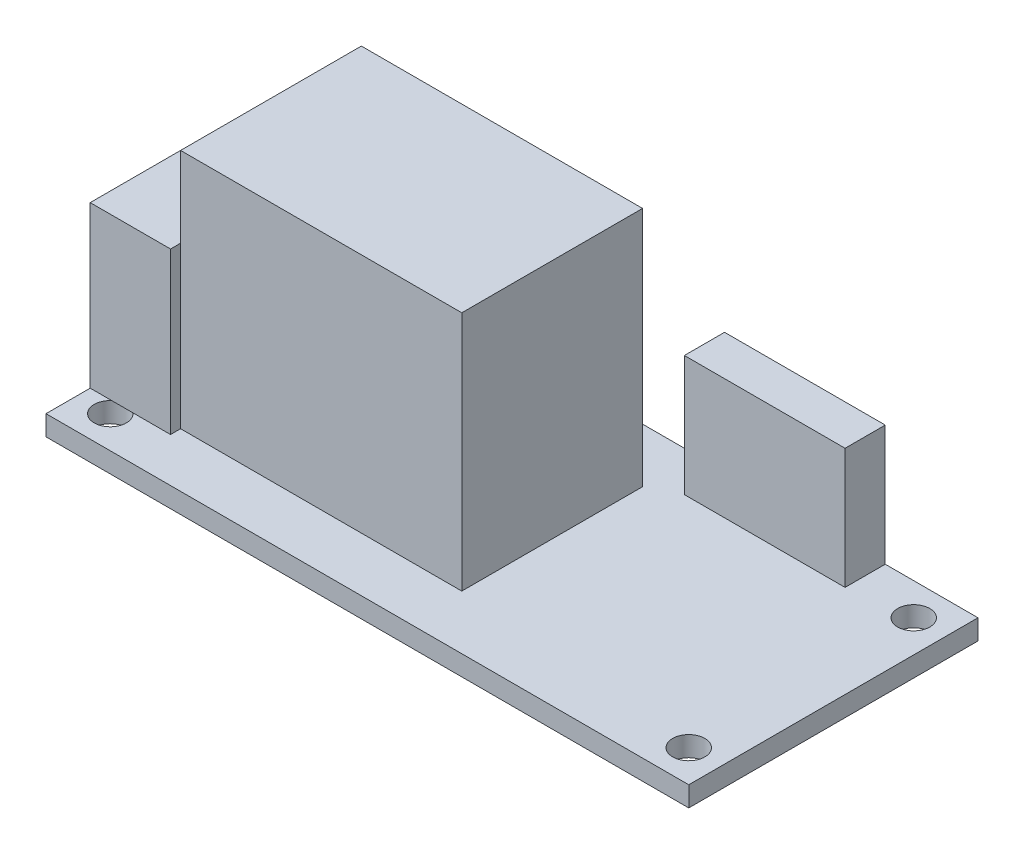
ISO-10303-21;
HEADER;
FILE_DESCRIPTION(('STEP AP214'),'2;1');
FILE_NAME('part.step','',(''),(''),'','','');
FILE_SCHEMA(('AUTOMOTIVE_DESIGN { 1 0 10303 214 1 1 1 1 }'));
ENDSEC;
DATA;
#1=APPLICATION_CONTEXT('core data for automotive mechanical design processes');
#2=APPLICATION_PROTOCOL_DEFINITION('international standard','automotive_design',2000,#1);
#3=PRODUCT_CONTEXT('',#1,'mechanical');
#4=PRODUCT('Part','Part','',(#3));
#5=PRODUCT_RELATED_PRODUCT_CATEGORY('part','',(#4));
#6=PRODUCT_DEFINITION_FORMATION('','',#4);
#7=PRODUCT_DEFINITION_CONTEXT('part definition',#1,'design');
#8=PRODUCT_DEFINITION('design','',#6,#7);
#9=PRODUCT_DEFINITION_SHAPE('','',#8);
#10=(LENGTH_UNIT() NAMED_UNIT(*) SI_UNIT(.MILLI.,.METRE.));
#11=(NAMED_UNIT(*) PLANE_ANGLE_UNIT() SI_UNIT($,.RADIAN.));
#12=(NAMED_UNIT(*) SI_UNIT($,.STERADIAN.) SOLID_ANGLE_UNIT());
#13=UNCERTAINTY_MEASURE_WITH_UNIT(LENGTH_MEASURE(1.E-05),#10,'distance_accuracy_value','');
#14=(GEOMETRIC_REPRESENTATION_CONTEXT(3) GLOBAL_UNCERTAINTY_ASSIGNED_CONTEXT((#13)) GLOBAL_UNIT_ASSIGNED_CONTEXT((#10,
#11,#12)) REPRESENTATION_CONTEXT('',''));
#15=CARTESIAN_POINT('',(0.,0.,0.));
#16=DIRECTION('',(0.,0.,1.));
#17=DIRECTION('',(1.,0.,0.));
#18=AXIS2_PLACEMENT_3D('',#15,#16,#17);
#19=CARTESIAN_POINT('',(0.,1.5875,0.));
#20=DIRECTION('',(0.,1.,0.));
#21=DIRECTION('',(0.,0.,1.));
#22=AXIS2_PLACEMENT_3D('',#19,#20,#21);
#23=PLANE('',#22);
#24=CARTESIAN_POINT('',(22.86,1.5875,-8.89));
#25=DIRECTION('',(0.,1.,0.));
#26=DIRECTION('',(0.,0.,1.));
#27=AXIS2_PLACEMENT_3D('',#24,#25,#26);
#28=CIRCLE('',#27,1.27);
#29=CARTESIAN_POINT('',(22.86,1.5875,-7.62));
#30=VERTEX_POINT('',#29);
#31=EDGE_CURVE('E325',#30,#30,#28,.T.);
#32=ORIENTED_EDGE('',*,*,#31,.F.);
#33=EDGE_LOOP('',(#32));
#34=FACE_BOUND('',#33,.T.);
#35=CARTESIAN_POINT('',(-22.86,1.5875,8.89));
#36=DIRECTION('',(0.,1.,0.));
#37=DIRECTION('',(0.,0.,1.));
#38=AXIS2_PLACEMENT_3D('',#35,#36,#37);
#39=CIRCLE('',#38,1.27);
#40=CARTESIAN_POINT('',(-23.700026041263,1.5875,7.9375));
#41=VERTEX_POINT('',#40);
#42=CARTESIAN_POINT('',(-22.019973958737,1.5875,7.9375));
#43=VERTEX_POINT('',#42);
#44=EDGE_CURVE('E321',#41,#43,#39,.T.);
#45=ORIENTED_EDGE('',*,*,#44,.F.);
#46=DIRECTION('',(1.,0.,0.));
#47=VECTOR('',#46,1.);
#48=CARTESIAN_POINT('',(-25.4,1.5875,7.9375));
#49=LINE('',#48,#47);
#50=CARTESIAN_POINT('',(-25.4,1.5875,7.9375));
#51=VERTEX_POINT('',#50);
#52=EDGE_CURVE('E216',#51,#41,#49,.T.);
#53=ORIENTED_EDGE('',*,*,#52,.F.);
#54=DIRECTION('',(0.,0.,1.));
#55=VECTOR('',#54,1.);
#56=CARTESIAN_POINT('',(-25.4,1.5875,-11.43));
#57=LINE('',#56,#55);
#58=CARTESIAN_POINT('',(-25.4,1.5875,11.43));
#59=VERTEX_POINT('',#58);
#60=EDGE_CURVE('E462',#51,#59,#57,.T.);
#61=ORIENTED_EDGE('',*,*,#60,.T.);
#62=DIRECTION('',(1.,0.,0.));
#63=VECTOR('',#62,1.);
#64=CARTESIAN_POINT('',(-25.4,1.5875,11.43));
#65=LINE('',#64,#63);
#66=CARTESIAN_POINT('',(25.4,1.5875,11.43));
#67=VERTEX_POINT('',#66);
#68=EDGE_CURVE('E458',#59,#67,#65,.T.);
#69=ORIENTED_EDGE('',*,*,#68,.T.);
#70=DIRECTION('',(0.,0.,-1.));
#71=VECTOR('',#70,1.);
#72=CARTESIAN_POINT('',(25.4,1.5875,-11.43));
#73=LINE('',#72,#71);
#74=CARTESIAN_POINT('',(25.4,1.5875,-11.43));
#75=VERTEX_POINT('',#74);
#76=EDGE_CURVE('E450',#67,#75,#73,.T.);
#77=ORIENTED_EDGE('',*,*,#76,.T.);
#78=DIRECTION('',(-1.,0.,0.));
#79=VECTOR('',#78,1.);
#80=CARTESIAN_POINT('',(-25.4,1.5875,-11.43));
#81=LINE('',#80,#79);
#82=CARTESIAN_POINT('',(18.0694027794747,1.5875,-11.43));
#83=VERTEX_POINT('',#82);
#84=EDGE_CURVE('E464',#75,#83,#81,.T.);
#85=ORIENTED_EDGE('',*,*,#84,.T.);
#86=DIRECTION('',(0.,0.,-1.));
#87=VECTOR('',#86,1.);
#88=CARTESIAN_POINT('',(18.0694027794747,1.5875,-11.43));
#89=LINE('',#88,#87);
#90=CARTESIAN_POINT('',(18.0694027794747,1.5875,-8.255));
#91=VERTEX_POINT('',#90);
#92=EDGE_CURVE('E291',#91,#83,#89,.T.);
#93=ORIENTED_EDGE('',*,*,#92,.F.);
#94=DIRECTION('',(1.,0.,0.));
#95=VECTOR('',#94,1.);
#96=CARTESIAN_POINT('',(5.36940277947472,1.5875,-8.255));
#97=LINE('',#96,#95);
#98=CARTESIAN_POINT('',(5.36940277947472,1.5875,-8.255));
#99=VERTEX_POINT('',#98);
#100=EDGE_CURVE('E296',#99,#91,#97,.T.);
#101=ORIENTED_EDGE('',*,*,#100,.F.);
#102=DIRECTION('',(0.,0.,1.));
#103=VECTOR('',#102,1.);
#104=CARTESIAN_POINT('',(5.36940277947472,1.5875,-11.43));
#105=LINE('',#104,#103);
#106=CARTESIAN_POINT('',(5.36940277947472,1.5875,-11.43));
#107=VERTEX_POINT('',#106);
#108=EDGE_CURVE('E300',#107,#99,#105,.T.);
#109=ORIENTED_EDGE('',*,*,#108,.F.);
#110=CARTESIAN_POINT('',(-25.4,1.5875,-11.43));
#111=VERTEX_POINT('',#110);
#112=EDGE_CURVE('E473',#107,#111,#81,.T.);
#113=ORIENTED_EDGE('',*,*,#112,.T.);
#114=CARTESIAN_POINT('',(-25.4,1.5875,-7.9375));
#115=VERTEX_POINT('',#114);
#116=EDGE_CURVE('E442',#111,#115,#57,.T.);
#117=ORIENTED_EDGE('',*,*,#116,.T.);
#118=DIRECTION('',(-1.,0.,0.));
#119=VECTOR('',#118,1.);
#120=CARTESIAN_POINT('',(-25.4,1.5875,-7.9375));
#121=LINE('',#120,#119);
#122=CARTESIAN_POINT('',(-23.700026041263,1.5875,-7.9375));
#123=VERTEX_POINT('',#122);
#124=EDGE_CURVE('E178',#123,#115,#121,.T.);
#125=ORIENTED_EDGE('',*,*,#124,.F.);
#126=CARTESIAN_POINT('',(-22.86,1.5875,-8.89));
#127=DIRECTION('',(0.,1.,0.));
#128=DIRECTION('',(0.,0.,1.));
#129=AXIS2_PLACEMENT_3D('',#126,#127,#128);
#130=CIRCLE('',#129,1.27);
#131=CARTESIAN_POINT('',(-22.019973958737,1.5875,-7.9375));
#132=VERTEX_POINT('',#131);
#133=EDGE_CURVE('E60',#132,#123,#130,.T.);
#134=ORIENTED_EDGE('',*,*,#133,.F.);
#135=CARTESIAN_POINT('',(-19.05,1.5875,-7.9375));
#136=VERTEX_POINT('',#135);
#137=EDGE_CURVE('E177',#136,#132,#121,.T.);
#138=ORIENTED_EDGE('',*,*,#137,.F.);
#139=DIRECTION('',(0.,0.,-1.));
#140=VECTOR('',#139,1.);
#141=CARTESIAN_POINT('',(-19.05,1.5875,7.9375));
#142=LINE('',#141,#140);
#143=CARTESIAN_POINT('',(-19.05,1.5875,-7.14375));
#144=VERTEX_POINT('',#143);
#145=EDGE_CURVE('E210',#144,#136,#142,.T.);
#146=ORIENTED_EDGE('',*,*,#145,.F.);
#147=DIRECTION('',(-1.,0.,0.));
#148=VECTOR('',#147,1.);
#149=CARTESIAN_POINT('',(-19.05,1.5875,-7.14375));
#150=LINE('',#149,#148);
#151=CARTESIAN_POINT('',(3.175,1.5875,-7.14375));
#152=VERTEX_POINT('',#151);
#153=EDGE_CURVE('E256',#152,#144,#150,.T.);
#154=ORIENTED_EDGE('',*,*,#153,.F.);
#155=DIRECTION('',(0.,0.,-1.));
#156=VECTOR('',#155,1.);
#157=CARTESIAN_POINT('',(3.175,1.5875,-7.14375));
#158=LINE('',#157,#156);
#159=CARTESIAN_POINT('',(3.17500000000001,1.5875,7.14375));
#160=VERTEX_POINT('',#159);
#161=EDGE_CURVE('E259',#160,#152,#158,.T.);
#162=ORIENTED_EDGE('',*,*,#161,.F.);
#163=DIRECTION('',(1.,0.,0.));
#164=VECTOR('',#163,1.);
#165=CARTESIAN_POINT('',(-19.05,1.5875,7.14375));
#166=LINE('',#165,#164);
#167=CARTESIAN_POINT('',(-19.05,1.5875,7.14375));
#168=VERTEX_POINT('',#167);
#169=EDGE_CURVE('E252',#168,#160,#166,.T.);
#170=ORIENTED_EDGE('',*,*,#169,.F.);
#171=CARTESIAN_POINT('',(-19.05,1.5875,7.9375));
#172=VERTEX_POINT('',#171);
#173=EDGE_CURVE('E206',#172,#168,#142,.T.);
#174=ORIENTED_EDGE('',*,*,#173,.F.);
#175=EDGE_CURVE('E222',#43,#172,#49,.T.);
#176=ORIENTED_EDGE('',*,*,#175,.F.);
#177=EDGE_LOOP('',(#45,#53,#61,#69,#77,#85,#93,#101,#109,#113,#117,#125,#134,#138,#146,#154,
#162,#170,#174,#176));
#178=FACE_BOUND('',#177,.T.);
#179=CARTESIAN_POINT('',(22.86,1.5875,8.89));
#180=DIRECTION('',(0.,1.,0.));
#181=DIRECTION('',(0.,0.,1.));
#182=AXIS2_PLACEMENT_3D('',#179,#180,#181);
#183=CIRCLE('',#182,1.27);
#184=CARTESIAN_POINT('',(22.86,1.5875,10.16));
#185=VERTEX_POINT('',#184);
#186=EDGE_CURVE('E332',#185,#185,#183,.T.);
#187=ORIENTED_EDGE('',*,*,#186,.F.);
#188=EDGE_LOOP('',(#187));
#189=FACE_BOUND('',#188,.T.);
#190=ADVANCED_FACE('F38',(#34,#178,#189),#23,.T.);
#191=CARTESIAN_POINT('',(-19.05,14.2875,7.9375));
#192=DIRECTION('',(-1.,0.,0.));
#193=DIRECTION('',(0.,0.,1.));
#194=AXIS2_PLACEMENT_3D('',#191,#192,#193);
#195=PLANE('',#194);
#196=DIRECTION('',(0.,-1.,0.));
#197=VECTOR('',#196,1.);
#198=CARTESIAN_POINT('',(-19.05,20.6375,-7.14375));
#199=LINE('',#198,#197);
#200=CARTESIAN_POINT('',(-19.05,14.2875,-7.14375));
#201=VERTEX_POINT('',#200);
#202=EDGE_CURVE('E241',#201,#144,#199,.T.);
#203=ORIENTED_EDGE('',*,*,#202,.T.);
#204=ORIENTED_EDGE('',*,*,#145,.T.);
#205=DIRECTION('',(0.,-1.,0.));
#206=VECTOR('',#205,1.);
#207=CARTESIAN_POINT('',(-19.05,14.2875,-7.9375));
#208=LINE('',#207,#206);
#209=CARTESIAN_POINT('',(-19.05,14.2875,-7.9375));
#210=VERTEX_POINT('',#209);
#211=EDGE_CURVE('E196',#210,#136,#208,.T.);
#212=ORIENTED_EDGE('',*,*,#211,.F.);
#213=DIRECTION('',(0.,0.,-1.));
#214=VECTOR('',#213,1.);
#215=CARTESIAN_POINT('',(-19.05,14.2875,7.9375));
#216=LINE('',#215,#214);
#217=EDGE_CURVE('E232',#201,#210,#216,.T.);
#218=ORIENTED_EDGE('',*,*,#217,.F.);
#219=EDGE_LOOP('',(#203,#204,#212,#218));
#220=FACE_BOUND('',#219,.T.);
#221=ADVANCED_FACE('F382',(#220),#195,.F.);
#222=DIRECTION('',(0.,-1.,0.));
#223=VECTOR('',#222,1.);
#224=CARTESIAN_POINT('',(-19.05,20.6375,7.14375));
#225=LINE('',#224,#223);
#226=CARTESIAN_POINT('',(-19.05,14.2875,7.14375));
#227=VERTEX_POINT('',#226);
#228=EDGE_CURVE('E246',#227,#168,#225,.T.);
#229=ORIENTED_EDGE('',*,*,#228,.F.);
#230=CARTESIAN_POINT('',(-19.05,14.2875,7.9375));
#231=VERTEX_POINT('',#230);
#232=EDGE_CURVE('E227',#231,#227,#216,.T.);
#233=ORIENTED_EDGE('',*,*,#232,.F.);
#234=DIRECTION('',(0.,-1.,0.));
#235=VECTOR('',#234,1.);
#236=CARTESIAN_POINT('',(-19.05,14.2875,7.9375));
#237=LINE('',#236,#235);
#238=EDGE_CURVE('E384',#231,#172,#237,.T.);
#239=ORIENTED_EDGE('',*,*,#238,.T.);
#240=ORIENTED_EDGE('',*,*,#173,.T.);
#241=EDGE_LOOP('',(#229,#233,#239,#240));
#242=FACE_BOUND('',#241,.T.);
#243=ADVANCED_FACE('F397',(#242),#195,.F.);
#244=CARTESIAN_POINT('',(25.4,1.5875,-11.43));
#245=DIRECTION('',(-1.,0.,0.));
#246=DIRECTION('',(0.,0.,1.));
#247=AXIS2_PLACEMENT_3D('',#244,#245,#246);
#248=PLANE('',#247);
#249=DIRECTION('',(0.,0.,-1.));
#250=VECTOR('',#249,1.);
#251=CARTESIAN_POINT('',(25.4,0.,-11.43));
#252=LINE('',#251,#250);
#253=CARTESIAN_POINT('',(25.4,0.,11.43));
#254=VERTEX_POINT('',#253);
#255=CARTESIAN_POINT('',(25.4,0.,-11.43));
#256=VERTEX_POINT('',#255);
#257=EDGE_CURVE('E438',#254,#256,#252,.T.);
#258=ORIENTED_EDGE('',*,*,#257,.T.);
#259=DIRECTION('',(0.,-1.,0.));
#260=VECTOR('',#259,1.);
#261=CARTESIAN_POINT('',(25.4,1.5875,-11.43));
#262=LINE('',#261,#260);
#263=EDGE_CURVE('E11',#75,#256,#262,.T.);
#264=ORIENTED_EDGE('',*,*,#263,.F.);
#265=ORIENTED_EDGE('',*,*,#76,.F.);
#266=DIRECTION('',(0.,-1.,0.));
#267=VECTOR('',#266,1.);
#268=CARTESIAN_POINT('',(25.4,1.5875,11.43));
#269=LINE('',#268,#267);
#270=EDGE_CURVE('E454',#67,#254,#269,.T.);
#271=ORIENTED_EDGE('',*,*,#270,.T.);
#272=EDGE_LOOP('',(#258,#264,#265,#271));
#273=FACE_BOUND('',#272,.T.);
#274=ADVANCED_FACE('F40',(#273),#248,.F.);
#275=CARTESIAN_POINT('',(-25.4,1.5875,-11.43));
#276=DIRECTION('',(0.,0.,1.));
#277=DIRECTION('',(1.,0.,0.));
#278=AXIS2_PLACEMENT_3D('',#275,#276,#277);
#279=PLANE('',#278);
#280=DIRECTION('',(-1.,0.,0.));
#281=VECTOR('',#280,1.);
#282=CARTESIAN_POINT('',(-25.4,0.,-11.43));
#283=LINE('',#282,#281);
#284=CARTESIAN_POINT('',(-25.4,0.,-11.43));
#285=VERTEX_POINT('',#284);
#286=EDGE_CURVE('E429',#256,#285,#283,.T.);
#287=ORIENTED_EDGE('',*,*,#286,.T.);
#288=DIRECTION('',(0.,-1.,0.));
#289=VECTOR('',#288,1.);
#290=CARTESIAN_POINT('',(-25.4,1.5875,-11.43));
#291=LINE('',#290,#289);
#292=EDGE_CURVE('E47',#111,#285,#291,.T.);
#293=ORIENTED_EDGE('',*,*,#292,.F.);
#294=ORIENTED_EDGE('',*,*,#112,.F.);
#295=DIRECTION('',(0.,-1.,0.));
#296=VECTOR('',#295,1.);
#297=CARTESIAN_POINT('',(5.36940277947472,11.1125,-11.43));
#298=LINE('',#297,#296);
#299=CARTESIAN_POINT('',(5.36940277947472,11.1125,-11.43));
#300=VERTEX_POINT('',#299);
#301=EDGE_CURVE('E286',#300,#107,#298,.T.);
#302=ORIENTED_EDGE('',*,*,#301,.F.);
#303=DIRECTION('',(-1.,0.,0.));
#304=VECTOR('',#303,1.);
#305=CARTESIAN_POINT('',(5.36940277947472,11.1125,-11.43));
#306=LINE('',#305,#304);
#307=CARTESIAN_POINT('',(18.0694027794747,11.1125,-11.43));
#308=VERTEX_POINT('',#307);
#309=EDGE_CURVE('E290',#308,#300,#306,.T.);
#310=ORIENTED_EDGE('',*,*,#309,.F.);
#311=DIRECTION('',(0.,-1.,0.));
#312=VECTOR('',#311,1.);
#313=CARTESIAN_POINT('',(18.0694027794747,11.1125,-11.43));
#314=LINE('',#313,#312);
#315=EDGE_CURVE('E282',#308,#83,#314,.T.);
#316=ORIENTED_EDGE('',*,*,#315,.T.);
#317=ORIENTED_EDGE('',*,*,#84,.F.);
#318=ORIENTED_EDGE('',*,*,#263,.T.);
#319=EDGE_LOOP('',(#287,#293,#294,#302,#310,#316,#317,#318));
#320=FACE_BOUND('',#319,.T.);
#321=ADVANCED_FACE('F404',(#320),#279,.F.);
#322=CARTESIAN_POINT('',(-25.4,1.5875,-11.43));
#323=DIRECTION('',(1.,0.,0.));
#324=DIRECTION('',(0.,0.,-1.));
#325=AXIS2_PLACEMENT_3D('',#322,#323,#324);
#326=PLANE('',#325);
#327=DIRECTION('',(0.,0.,1.));
#328=VECTOR('',#327,1.);
#329=CARTESIAN_POINT('',(-25.4,0.,-11.43));
#330=LINE('',#329,#328);
#331=CARTESIAN_POINT('',(-25.4,0.,11.43));
#332=VERTEX_POINT('',#331);
#333=EDGE_CURVE('E437',#285,#332,#330,.T.);
#334=ORIENTED_EDGE('',*,*,#333,.T.);
#335=DIRECTION('',(0.,-1.,0.));
#336=VECTOR('',#335,1.);
#337=CARTESIAN_POINT('',(-25.4,1.5875,11.43));
#338=LINE('',#337,#336);
#339=EDGE_CURVE('E444',#59,#332,#338,.T.);
#340=ORIENTED_EDGE('',*,*,#339,.F.);
#341=ORIENTED_EDGE('',*,*,#60,.F.);
#342=DIRECTION('',(0.,-1.,0.));
#343=VECTOR('',#342,1.);
#344=CARTESIAN_POINT('',(-25.4,14.2875,7.9375));
#345=LINE('',#344,#343);
#346=CARTESIAN_POINT('',(-25.4,14.2875,7.9375));
#347=VERTEX_POINT('',#346);
#348=EDGE_CURVE('E394',#347,#51,#345,.T.);
#349=ORIENTED_EDGE('',*,*,#348,.F.);
#350=DIRECTION('',(0.,0.,1.));
#351=VECTOR('',#350,1.);
#352=CARTESIAN_POINT('',(-25.4,14.2875,7.9375));
#353=LINE('',#352,#351);
#354=CARTESIAN_POINT('',(-25.4,14.2875,-7.9375));
#355=VERTEX_POINT('',#354);
#356=EDGE_CURVE('E198',#355,#347,#353,.T.);
#357=ORIENTED_EDGE('',*,*,#356,.F.);
#358=DIRECTION('',(0.,-1.,0.));
#359=VECTOR('',#358,1.);
#360=CARTESIAN_POINT('',(-25.4,14.2875,-7.9375));
#361=LINE('',#360,#359);
#362=EDGE_CURVE('E226',#355,#115,#361,.T.);
#363=ORIENTED_EDGE('',*,*,#362,.T.);
#364=ORIENTED_EDGE('',*,*,#116,.F.);
#365=ORIENTED_EDGE('',*,*,#292,.T.);
#366=EDGE_LOOP('',(#334,#340,#341,#349,#357,#363,#364,#365));
#367=FACE_BOUND('',#366,.T.);
#368=ADVANCED_FACE('F392',(#367),#326,.F.);
#369=CARTESIAN_POINT('',(-25.4,1.5875,11.43));
#370=DIRECTION('',(0.,0.,-1.));
#371=DIRECTION('',(-1.,0.,0.));
#372=AXIS2_PLACEMENT_3D('',#369,#370,#371);
#373=PLANE('',#372);
#374=DIRECTION('',(1.,0.,0.));
#375=VECTOR('',#374,1.);
#376=CARTESIAN_POINT('',(-25.4,0.,11.43));
#377=LINE('',#376,#375);
#378=EDGE_CURVE('E446',#332,#254,#377,.T.);
#379=ORIENTED_EDGE('',*,*,#378,.T.);
#380=ORIENTED_EDGE('',*,*,#270,.F.);
#381=ORIENTED_EDGE('',*,*,#68,.F.);
#382=ORIENTED_EDGE('',*,*,#339,.T.);
#383=EDGE_LOOP('',(#379,#380,#381,#382));
#384=FACE_BOUND('',#383,.T.);
#385=ADVANCED_FACE('F418',(#384),#373,.F.);
#386=CARTESIAN_POINT('',(0.,0.,0.));
#387=DIRECTION('',(0.,1.,0.));
#388=DIRECTION('',(0.,0.,1.));
#389=AXIS2_PLACEMENT_3D('',#386,#387,#388);
#390=PLANE('',#389);
#391=CARTESIAN_POINT('',(22.86,0.,-8.89));
#392=DIRECTION('',(0.,1.,0.));
#393=DIRECTION('',(0.,0.,1.));
#394=AXIS2_PLACEMENT_3D('',#391,#392,#393);
#395=CIRCLE('',#394,1.27);
#396=CARTESIAN_POINT('',(22.86,0.,-7.62));
#397=VERTEX_POINT('',#396);
#398=EDGE_CURVE('E182',#397,#397,#395,.T.);
#399=ORIENTED_EDGE('',*,*,#398,.T.);
#400=EDGE_LOOP('',(#399));
#401=FACE_BOUND('',#400,.T.);
#402=CARTESIAN_POINT('',(-22.86,0.,8.89));
#403=DIRECTION('',(0.,1.,0.));
#404=DIRECTION('',(0.,0.,1.));
#405=AXIS2_PLACEMENT_3D('',#402,#403,#404);
#406=CIRCLE('',#405,1.27);
#407=CARTESIAN_POINT('',(-22.86,0.,10.16));
#408=VERTEX_POINT('',#407);
#409=EDGE_CURVE('E320',#408,#408,#406,.T.);
#410=ORIENTED_EDGE('',*,*,#409,.T.);
#411=EDGE_LOOP('',(#410));
#412=FACE_BOUND('',#411,.T.);
#413=CARTESIAN_POINT('',(22.86,0.,8.89));
#414=DIRECTION('',(0.,1.,0.));
#415=DIRECTION('',(0.,0.,1.));
#416=AXIS2_PLACEMENT_3D('',#413,#414,#415);
#417=CIRCLE('',#416,1.27);
#418=CARTESIAN_POINT('',(22.86,0.,10.16));
#419=VERTEX_POINT('',#418);
#420=EDGE_CURVE('E336',#419,#419,#417,.T.);
#421=ORIENTED_EDGE('',*,*,#420,.T.);
#422=EDGE_LOOP('',(#421));
#423=FACE_BOUND('',#422,.T.);
#424=CARTESIAN_POINT('',(-22.86,0.,-8.89));
#425=DIRECTION('',(0.,1.,0.));
#426=DIRECTION('',(0.,0.,1.));
#427=AXIS2_PLACEMENT_3D('',#424,#425,#426);
#428=CIRCLE('',#427,1.27);
#429=CARTESIAN_POINT('',(-22.86,0.,-7.61999999999999));
#430=VERTEX_POINT('',#429);
#431=EDGE_CURVE('E192',#430,#430,#428,.T.);
#432=ORIENTED_EDGE('',*,*,#431,.T.);
#433=EDGE_LOOP('',(#432));
#434=FACE_BOUND('',#433,.T.);
#435=ORIENTED_EDGE('',*,*,#257,.F.);
#436=ORIENTED_EDGE('',*,*,#378,.F.);
#437=ORIENTED_EDGE('',*,*,#333,.F.);
#438=ORIENTED_EDGE('',*,*,#286,.F.);
#439=EDGE_LOOP('',(#435,#436,#437,#438));
#440=FACE_BOUND('',#439,.T.);
#441=ADVANCED_FACE('F415',(#401,#412,#423,#434,#440),#390,.F.);
#442=CARTESIAN_POINT('',(-25.4,14.2875,7.9375));
#443=DIRECTION('',(0.,0.,-1.));
#444=DIRECTION('',(-1.,0.,0.));
#445=AXIS2_PLACEMENT_3D('',#442,#443,#444);
#446=PLANE('',#445);
#447=ORIENTED_EDGE('',*,*,#52,.T.);
#448=EDGE_CURVE('E221',#41,#43,#49,.T.);
#449=ORIENTED_EDGE('',*,*,#448,.T.);
#450=ORIENTED_EDGE('',*,*,#175,.T.);
#451=ORIENTED_EDGE('',*,*,#238,.F.);
#452=DIRECTION('',(1.,0.,0.));
#453=VECTOR('',#452,1.);
#454=CARTESIAN_POINT('',(-25.4,14.2875,7.9375));
#455=LINE('',#454,#453);
#456=EDGE_CURVE('E201',#347,#231,#455,.T.);
#457=ORIENTED_EDGE('',*,*,#456,.F.);
#458=ORIENTED_EDGE('',*,*,#348,.T.);
#459=EDGE_LOOP('',(#447,#449,#450,#451,#457,#458));
#460=FACE_BOUND('',#459,.T.);
#461=ADVANCED_FACE('F350',(#460),#446,.F.);
#462=CARTESIAN_POINT('',(-25.4,14.2875,-7.9375));
#463=DIRECTION('',(0.,0.,1.));
#464=DIRECTION('',(1.,0.,0.));
#465=AXIS2_PLACEMENT_3D('',#462,#463,#464);
#466=PLANE('',#465);
#467=ORIENTED_EDGE('',*,*,#137,.T.);
#468=EDGE_CURVE('E170',#132,#123,#121,.T.);
#469=ORIENTED_EDGE('',*,*,#468,.T.);
#470=ORIENTED_EDGE('',*,*,#124,.T.);
#471=ORIENTED_EDGE('',*,*,#362,.F.);
#472=DIRECTION('',(-1.,0.,0.));
#473=VECTOR('',#472,1.);
#474=CARTESIAN_POINT('',(-25.4,14.2875,-7.9375));
#475=LINE('',#474,#473);
#476=EDGE_CURVE('E223',#210,#355,#475,.T.);
#477=ORIENTED_EDGE('',*,*,#476,.F.);
#478=ORIENTED_EDGE('',*,*,#211,.T.);
#479=EDGE_LOOP('',(#467,#469,#470,#471,#477,#478));
#480=FACE_BOUND('',#479,.T.);
#481=ADVANCED_FACE('F193',(#480),#466,.F.);
#482=CARTESIAN_POINT('',(0.,14.2875,0.));
#483=DIRECTION('',(0.,-1.,0.));
#484=DIRECTION('',(0.,0.,-1.));
#485=AXIS2_PLACEMENT_3D('',#482,#483,#484);
#486=PLANE('',#485);
#487=ORIENTED_EDGE('',*,*,#356,.T.);
#488=ORIENTED_EDGE('',*,*,#456,.T.);
#489=ORIENTED_EDGE('',*,*,#232,.T.);
#490=EDGE_CURVE('E231',#227,#201,#216,.T.);
#491=ORIENTED_EDGE('',*,*,#490,.T.);
#492=ORIENTED_EDGE('',*,*,#217,.T.);
#493=ORIENTED_EDGE('',*,*,#476,.T.);
#494=EDGE_LOOP('',(#487,#488,#489,#491,#492,#493));
#495=FACE_BOUND('',#494,.T.);
#496=ADVANCED_FACE('F380',(#495),#486,.F.);
#497=CARTESIAN_POINT('',(-19.05,20.6375,-7.14375));
#498=DIRECTION('',(1.,0.,0.));
#499=DIRECTION('',(0.,0.,-1.));
#500=AXIS2_PLACEMENT_3D('',#497,#498,#499);
#501=PLANE('',#500);
#502=CARTESIAN_POINT('',(-19.05,20.6375,-7.14375));
#503=VERTEX_POINT('',#502);
#504=EDGE_CURVE('E238',#503,#201,#199,.T.);
#505=ORIENTED_EDGE('',*,*,#504,.T.);
#506=ORIENTED_EDGE('',*,*,#490,.F.);
#507=CARTESIAN_POINT('',(-19.05,20.6375,7.14375));
#508=VERTEX_POINT('',#507);
#509=EDGE_CURVE('E242',#508,#227,#225,.T.);
#510=ORIENTED_EDGE('',*,*,#509,.F.);
#511=DIRECTION('',(0.,0.,1.));
#512=VECTOR('',#511,1.);
#513=CARTESIAN_POINT('',(-19.05,20.6375,-7.14375));
#514=LINE('',#513,#512);
#515=EDGE_CURVE('E266',#503,#508,#514,.T.);
#516=ORIENTED_EDGE('',*,*,#515,.F.);
#517=EDGE_LOOP('',(#505,#506,#510,#516));
#518=FACE_BOUND('',#517,.T.);
#519=ADVANCED_FACE('F373',(#518),#501,.F.);
#520=CARTESIAN_POINT('',(3.175,20.6375,-7.14375));
#521=DIRECTION('',(-1.,0.,0.));
#522=DIRECTION('',(0.,0.,1.));
#523=AXIS2_PLACEMENT_3D('',#520,#521,#522);
#524=PLANE('',#523);
#525=ORIENTED_EDGE('',*,*,#161,.T.);
#526=DIRECTION('',(0.,-1.,0.));
#527=VECTOR('',#526,1.);
#528=CARTESIAN_POINT('',(3.175,20.6375,-7.14375));
#529=LINE('',#528,#527);
#530=CARTESIAN_POINT('',(3.175,20.6375,-7.14375));
#531=VERTEX_POINT('',#530);
#532=EDGE_CURVE('E235',#531,#152,#529,.T.);
#533=ORIENTED_EDGE('',*,*,#532,.F.);
#534=DIRECTION('',(0.,0.,-1.));
#535=VECTOR('',#534,1.);
#536=CARTESIAN_POINT('',(3.175,20.6375,-7.14375));
#537=LINE('',#536,#535);
#538=CARTESIAN_POINT('',(3.17500000000001,20.6375,7.14375));
#539=VERTEX_POINT('',#538);
#540=EDGE_CURVE('E255',#539,#531,#537,.T.);
#541=ORIENTED_EDGE('',*,*,#540,.F.);
#542=DIRECTION('',(0.,-1.,0.));
#543=VECTOR('',#542,1.);
#544=CARTESIAN_POINT('',(3.17500000000001,20.6375,7.14375));
#545=LINE('',#544,#543);
#546=EDGE_CURVE('E247',#539,#160,#545,.T.);
#547=ORIENTED_EDGE('',*,*,#546,.T.);
#548=EDGE_LOOP('',(#525,#533,#541,#547));
#549=FACE_BOUND('',#548,.T.);
#550=ADVANCED_FACE('F366',(#549),#524,.F.);
#551=CARTESIAN_POINT('',(-19.05,20.6375,-7.14375));
#552=DIRECTION('',(0.,0.,1.));
#553=DIRECTION('',(1.,0.,0.));
#554=AXIS2_PLACEMENT_3D('',#551,#552,#553);
#555=PLANE('',#554);
#556=ORIENTED_EDGE('',*,*,#153,.T.);
#557=ORIENTED_EDGE('',*,*,#202,.F.);
#558=ORIENTED_EDGE('',*,*,#504,.F.);
#559=DIRECTION('',(-1.,0.,0.));
#560=VECTOR('',#559,1.);
#561=CARTESIAN_POINT('',(-19.05,20.6375,-7.14375));
#562=LINE('',#561,#560);
#563=EDGE_CURVE('E269',#531,#503,#562,.T.);
#564=ORIENTED_EDGE('',*,*,#563,.F.);
#565=ORIENTED_EDGE('',*,*,#532,.T.);
#566=EDGE_LOOP('',(#556,#557,#558,#564,#565));
#567=FACE_BOUND('',#566,.T.);
#568=ADVANCED_FACE('F507',(#567),#555,.F.);
#569=CARTESIAN_POINT('',(-19.05,20.6375,7.14375));
#570=DIRECTION('',(0.,0.,-1.));
#571=DIRECTION('',(-1.,0.,0.));
#572=AXIS2_PLACEMENT_3D('',#569,#570,#571);
#573=PLANE('',#572);
#574=ORIENTED_EDGE('',*,*,#169,.T.);
#575=ORIENTED_EDGE('',*,*,#546,.F.);
#576=DIRECTION('',(1.,0.,0.));
#577=VECTOR('',#576,1.);
#578=CARTESIAN_POINT('',(-19.05,20.6375,7.14375));
#579=LINE('',#578,#577);
#580=EDGE_CURVE('E251',#508,#539,#579,.T.);
#581=ORIENTED_EDGE('',*,*,#580,.F.);
#582=ORIENTED_EDGE('',*,*,#509,.T.);
#583=ORIENTED_EDGE('',*,*,#228,.T.);
#584=EDGE_LOOP('',(#574,#575,#581,#582,#583));
#585=FACE_BOUND('',#584,.T.);
#586=ADVANCED_FACE('F357',(#585),#573,.F.);
#587=CARTESIAN_POINT('',(0.,20.6375,0.));
#588=DIRECTION('',(0.,1.,0.));
#589=DIRECTION('',(0.,0.,1.));
#590=AXIS2_PLACEMENT_3D('',#587,#588,#589);
#591=PLANE('',#590);
#592=ORIENTED_EDGE('',*,*,#540,.T.);
#593=ORIENTED_EDGE('',*,*,#563,.T.);
#594=ORIENTED_EDGE('',*,*,#515,.T.);
#595=ORIENTED_EDGE('',*,*,#580,.T.);
#596=EDGE_LOOP('',(#592,#593,#594,#595));
#597=FACE_BOUND('',#596,.T.);
#598=ADVANCED_FACE('F369',(#597),#591,.T.);
#599=CARTESIAN_POINT('',(5.36940277947472,11.1125,-11.43));
#600=DIRECTION('',(1.,0.,0.));
#601=DIRECTION('',(0.,0.,-1.));
#602=AXIS2_PLACEMENT_3D('',#599,#600,#601);
#603=PLANE('',#602);
#604=ORIENTED_EDGE('',*,*,#108,.T.);
#605=DIRECTION('',(0.,-1.,0.));
#606=VECTOR('',#605,1.);
#607=CARTESIAN_POINT('',(5.36940277947472,11.1125,-8.255));
#608=LINE('',#607,#606);
#609=CARTESIAN_POINT('',(5.36940277947472,11.1125,-8.255));
#610=VERTEX_POINT('',#609);
#611=EDGE_CURVE('E263',#610,#99,#608,.T.);
#612=ORIENTED_EDGE('',*,*,#611,.F.);
#613=DIRECTION('',(0.,0.,1.));
#614=VECTOR('',#613,1.);
#615=CARTESIAN_POINT('',(5.36940277947472,11.1125,-11.43));
#616=LINE('',#615,#614);
#617=EDGE_CURVE('E295',#300,#610,#616,.T.);
#618=ORIENTED_EDGE('',*,*,#617,.F.);
#619=ORIENTED_EDGE('',*,*,#301,.T.);
#620=EDGE_LOOP('',(#604,#612,#618,#619));
#621=FACE_BOUND('',#620,.T.);
#622=ADVANCED_FACE('F494',(#621),#603,.F.);
#623=CARTESIAN_POINT('',(5.36940277947472,11.1125,-8.255));
#624=DIRECTION('',(0.,0.,-1.));
#625=DIRECTION('',(-1.,0.,0.));
#626=AXIS2_PLACEMENT_3D('',#623,#624,#625);
#627=PLANE('',#626);
#628=ORIENTED_EDGE('',*,*,#100,.T.);
#629=DIRECTION('',(0.,-1.,0.));
#630=VECTOR('',#629,1.);
#631=CARTESIAN_POINT('',(18.0694027794747,11.1125,-8.255));
#632=LINE('',#631,#630);
#633=CARTESIAN_POINT('',(18.0694027794747,11.1125,-8.255));
#634=VERTEX_POINT('',#633);
#635=EDGE_CURVE('E278',#634,#91,#632,.T.);
#636=ORIENTED_EDGE('',*,*,#635,.F.);
#637=DIRECTION('',(1.,0.,0.));
#638=VECTOR('',#637,1.);
#639=CARTESIAN_POINT('',(5.36940277947472,11.1125,-8.255));
#640=LINE('',#639,#638);
#641=EDGE_CURVE('E309',#610,#634,#640,.T.);
#642=ORIENTED_EDGE('',*,*,#641,.F.);
#643=ORIENTED_EDGE('',*,*,#611,.T.);
#644=EDGE_LOOP('',(#628,#636,#642,#643));
#645=FACE_BOUND('',#644,.T.);
#646=ADVANCED_FACE('F491',(#645),#627,.F.);
#647=CARTESIAN_POINT('',(18.0694027794747,11.1125,-11.43));
#648=DIRECTION('',(-1.,0.,0.));
#649=DIRECTION('',(0.,0.,1.));
#650=AXIS2_PLACEMENT_3D('',#647,#648,#649);
#651=PLANE('',#650);
#652=ORIENTED_EDGE('',*,*,#92,.T.);
#653=ORIENTED_EDGE('',*,*,#315,.F.);
#654=DIRECTION('',(0.,0.,-1.));
#655=VECTOR('',#654,1.);
#656=CARTESIAN_POINT('',(18.0694027794747,11.1125,-11.43));
#657=LINE('',#656,#655);
#658=EDGE_CURVE('E306',#634,#308,#657,.T.);
#659=ORIENTED_EDGE('',*,*,#658,.F.);
#660=ORIENTED_EDGE('',*,*,#635,.T.);
#661=EDGE_LOOP('',(#652,#653,#659,#660));
#662=FACE_BOUND('',#661,.T.);
#663=ADVANCED_FACE('F481',(#662),#651,.F.);
#664=CARTESIAN_POINT('',(0.,11.1125,0.));
#665=DIRECTION('',(0.,1.,0.));
#666=DIRECTION('',(0.,0.,1.));
#667=AXIS2_PLACEMENT_3D('',#664,#665,#666);
#668=PLANE('',#667);
#669=ORIENTED_EDGE('',*,*,#617,.T.);
#670=ORIENTED_EDGE('',*,*,#641,.T.);
#671=ORIENTED_EDGE('',*,*,#658,.T.);
#672=ORIENTED_EDGE('',*,*,#309,.T.);
#673=EDGE_LOOP('',(#669,#670,#671,#672));
#674=FACE_BOUND('',#673,.T.);
#675=ADVANCED_FACE('F488',(#674),#668,.T.);
#676=CARTESIAN_POINT('',(-22.86,1.5875,-8.89));
#677=DIRECTION('',(0.,1.,0.));
#678=DIRECTION('',(0.,0.,1.));
#679=AXIS2_PLACEMENT_3D('',#676,#677,#678);
#680=PLANE('',#679);
#681=EDGE_CURVE('E172',#123,#132,#130,.T.);
#682=ORIENTED_EDGE('',*,*,#681,.F.);
#683=ORIENTED_EDGE('',*,*,#468,.F.);
#684=EDGE_LOOP('',(#682,#683));
#685=FACE_BOUND('',#684,.T.);
#686=ADVANCED_FACE('F171',(#685),#680,.F.);
#687=CARTESIAN_POINT('',(-22.86,0.,-8.89));
#688=DIRECTION('',(0.,1.,0.));
#689=DIRECTION('',(0.,0.,1.));
#690=AXIS2_PLACEMENT_3D('',#687,#688,#689);
#691=CYLINDRICAL_SURFACE('',#690,1.27);
#692=ORIENTED_EDGE('',*,*,#431,.F.);
#693=EDGE_LOOP('',(#692));
#694=FACE_BOUND('',#693,.T.);
#695=ORIENTED_EDGE('',*,*,#133,.T.);
#696=ORIENTED_EDGE('',*,*,#681,.T.);
#697=EDGE_LOOP('',(#695,#696));
#698=FACE_BOUND('',#697,.T.);
#699=ADVANCED_FACE('F180',(#694,#698),#691,.F.);
#700=CARTESIAN_POINT('',(-22.86,1.5875,8.89));
#701=DIRECTION('',(0.,1.,0.));
#702=DIRECTION('',(0.,0.,1.));
#703=AXIS2_PLACEMENT_3D('',#700,#701,#702);
#704=PLANE('',#703);
#705=EDGE_CURVE('E53',#43,#41,#39,.T.);
#706=ORIENTED_EDGE('',*,*,#705,.F.);
#707=ORIENTED_EDGE('',*,*,#448,.F.);
#708=EDGE_LOOP('',(#706,#707));
#709=FACE_BOUND('',#708,.T.);
#710=ADVANCED_FACE('F631',(#709),#704,.F.);
#711=CARTESIAN_POINT('',(-22.86,0.,8.89));
#712=DIRECTION('',(0.,1.,0.));
#713=DIRECTION('',(0.,0.,1.));
#714=AXIS2_PLACEMENT_3D('',#711,#712,#713);
#715=CYLINDRICAL_SURFACE('',#714,1.27);
#716=ORIENTED_EDGE('',*,*,#409,.F.);
#717=EDGE_LOOP('',(#716));
#718=FACE_BOUND('',#717,.T.);
#719=ORIENTED_EDGE('',*,*,#705,.T.);
#720=ORIENTED_EDGE('',*,*,#44,.T.);
#721=EDGE_LOOP('',(#719,#720));
#722=FACE_BOUND('',#721,.T.);
#723=ADVANCED_FACE('F344',(#718,#722),#715,.F.);
#724=CARTESIAN_POINT('',(22.86,0.,8.89));
#725=DIRECTION('',(0.,1.,0.));
#726=DIRECTION('',(0.,0.,1.));
#727=AXIS2_PLACEMENT_3D('',#724,#725,#726);
#728=CYLINDRICAL_SURFACE('',#727,1.27);
#729=ORIENTED_EDGE('',*,*,#420,.F.);
#730=EDGE_LOOP('',(#729));
#731=FACE_BOUND('',#730,.T.);
#732=ORIENTED_EDGE('',*,*,#186,.T.);
#733=EDGE_LOOP('',(#732));
#734=FACE_BOUND('',#733,.T.);
#735=ADVANCED_FACE('F645',(#731,#734),#728,.F.);
#736=CARTESIAN_POINT('',(22.86,0.,-8.89));
#737=DIRECTION('',(0.,1.,0.));
#738=DIRECTION('',(0.,0.,1.));
#739=AXIS2_PLACEMENT_3D('',#736,#737,#738);
#740=CYLINDRICAL_SURFACE('',#739,1.27);
#741=ORIENTED_EDGE('',*,*,#398,.F.);
#742=EDGE_LOOP('',(#741));
#743=FACE_BOUND('',#742,.T.);
#744=ORIENTED_EDGE('',*,*,#31,.T.);
#745=EDGE_LOOP('',(#744));
#746=FACE_BOUND('',#745,.T.);
#747=ADVANCED_FACE('F653',(#743,#746),#740,.F.);
#748=CLOSED_SHELL('',(#190,#221,#243,#274,#321,#368,#385,#441,#461,#481,#496,#519,#550,#568,
#586,#598,#622,#646,#663,#675,#686,#699,#710,#723,#735,#747));
#749=MANIFOLD_SOLID_BREP('B2',#748);
#750=ADVANCED_BREP_SHAPE_REPRESENTATION('',(#18,#749),#14);
#751=SHAPE_DEFINITION_REPRESENTATION(#9,#750);
ENDSEC;
END-ISO-10303-21;
